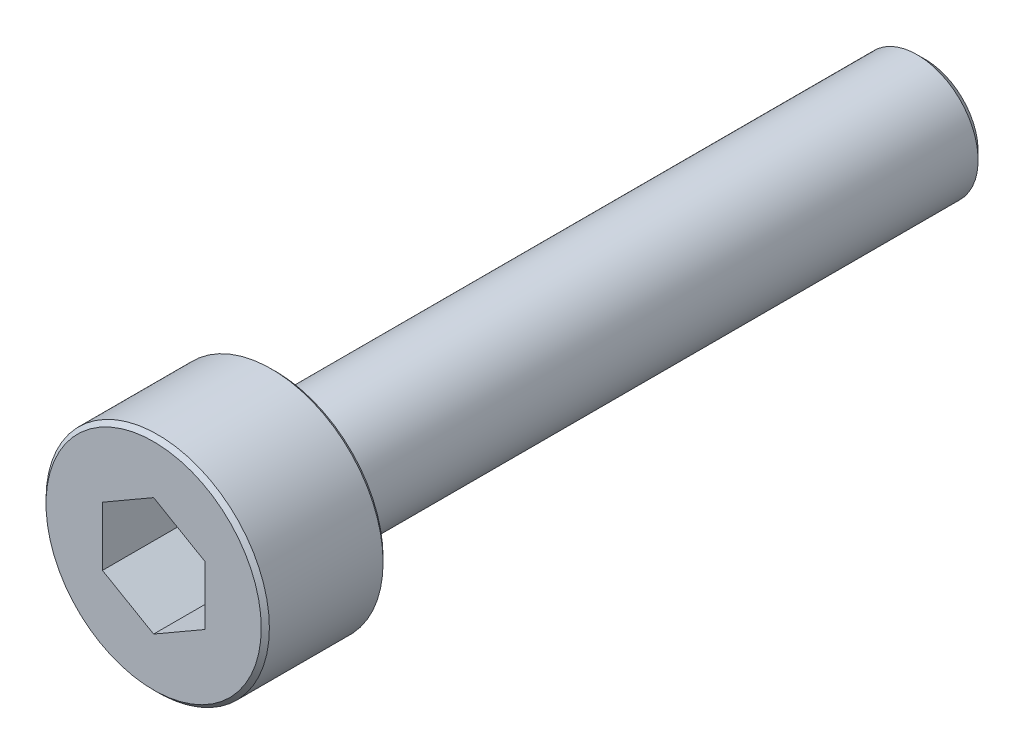
ISO-10303-21;
HEADER;
FILE_DESCRIPTION(('STEP AP214'),'2;1');
FILE_NAME('part.step','',(''),(''),'','','');
FILE_SCHEMA(('AUTOMOTIVE_DESIGN { 1 0 10303 214 1 1 1 1 }'));
ENDSEC;
DATA;
#1=APPLICATION_CONTEXT('core data for automotive mechanical design processes');
#2=APPLICATION_PROTOCOL_DEFINITION('international standard','automotive_design',2000,#1);
#3=PRODUCT_CONTEXT('',#1,'mechanical');
#4=PRODUCT('Part','Part','',(#3));
#5=PRODUCT_RELATED_PRODUCT_CATEGORY('part','',(#4));
#6=PRODUCT_DEFINITION_FORMATION('','',#4);
#7=PRODUCT_DEFINITION_CONTEXT('part definition',#1,'design');
#8=PRODUCT_DEFINITION('design','',#6,#7);
#9=PRODUCT_DEFINITION_SHAPE('','',#8);
#10=(LENGTH_UNIT() NAMED_UNIT(*) SI_UNIT(.MILLI.,.METRE.));
#11=(NAMED_UNIT(*) PLANE_ANGLE_UNIT() SI_UNIT($,.RADIAN.));
#12=(NAMED_UNIT(*) SI_UNIT($,.STERADIAN.) SOLID_ANGLE_UNIT());
#13=UNCERTAINTY_MEASURE_WITH_UNIT(LENGTH_MEASURE(1.E-05),#10,'distance_accuracy_value','');
#14=(GEOMETRIC_REPRESENTATION_CONTEXT(3) GLOBAL_UNCERTAINTY_ASSIGNED_CONTEXT((#13)) GLOBAL_UNIT_ASSIGNED_CONTEXT((#10,
#11,#12)) REPRESENTATION_CONTEXT('',''));
#15=CARTESIAN_POINT('',(0.,0.,0.));
#16=DIRECTION('',(0.,0.,1.));
#17=DIRECTION('',(1.,0.,0.));
#18=AXIS2_PLACEMENT_3D('',#15,#16,#17);
#19=CARTESIAN_POINT('',(0.,0.,16.));
#20=DIRECTION('',(0.,0.,1.));
#21=DIRECTION('',(1.,0.,0.));
#22=AXIS2_PLACEMENT_3D('',#19,#20,#21);
#23=CYLINDRICAL_SURFACE('',#22,2.75);
#24=CARTESIAN_POINT('',(0.,0.,16.1000012636342));
#25=DIRECTION('',(0.,0.,-1.));
#26=DIRECTION('',(-1.,0.,0.));
#27=AXIS2_PLACEMENT_3D('',#24,#25,#26);
#28=CIRCLE('',#27,2.75);
#29=CARTESIAN_POINT('',(2.75,0.,16.1000012636342));
#30=VERTEX_POINT('',#29);
#31=EDGE_CURVE('E155',#30,#30,#28,.F.);
#32=ORIENTED_EDGE('',*,*,#31,.T.);
#33=EDGE_LOOP('',(#32));
#34=FACE_BOUND('',#33,.T.);
#35=CARTESIAN_POINT('',(0.,0.,18.8999986849225));
#36=DIRECTION('',(0.,0.,1.));
#37=DIRECTION('',(1.,0.,0.));
#38=AXIS2_PLACEMENT_3D('',#35,#36,#37);
#39=CIRCLE('',#38,2.75);
#40=CARTESIAN_POINT('',(2.75,0.,18.8999986849225));
#41=VERTEX_POINT('',#40);
#42=EDGE_CURVE('E152',#41,#41,#39,.F.);
#43=ORIENTED_EDGE('',*,*,#42,.T.);
#44=EDGE_LOOP('',(#43));
#45=FACE_BOUND('',#44,.T.);
#46=ADVANCED_FACE('F41',(#34,#45),#23,.T.);
#47=CARTESIAN_POINT('',(2.75,0.,16.));
#48=DIRECTION('',(0.,0.,-1.));
#49=DIRECTION('',(-1.,0.,0.));
#50=AXIS2_PLACEMENT_3D('',#47,#48,#49);
#51=PLANE('',#50);
#52=CARTESIAN_POINT('',(0.,0.,16.));
#53=DIRECTION('',(0.,0.,-1.));
#54=DIRECTION('',(-1.,0.,0.));
#55=AXIS2_PLACEMENT_3D('',#52,#53,#54);
#56=CIRCLE('',#55,2.64999868492255);
#57=CARTESIAN_POINT('',(2.64999868492255,0.,16.));
#58=VERTEX_POINT('',#57);
#59=EDGE_CURVE('E158',#58,#58,#56,.T.);
#60=ORIENTED_EDGE('',*,*,#59,.T.);
#61=EDGE_LOOP('',(#60));
#62=FACE_BOUND('',#61,.T.);
#63=CARTESIAN_POINT('',(0.,0.,16.));
#64=DIRECTION('',(0.,0.,-1.));
#65=DIRECTION('',(-1.,0.,0.));
#66=AXIS2_PLACEMENT_3D('',#63,#64,#65);
#67=CIRCLE('',#66,1.5);
#68=CARTESIAN_POINT('',(-1.5,0.,16.));
#69=VERTEX_POINT('',#68);
#70=EDGE_CURVE('E144',#69,#69,#67,.T.);
#71=ORIENTED_EDGE('',*,*,#70,.F.);
#72=EDGE_LOOP('',(#71));
#73=FACE_BOUND('',#72,.T.);
#74=ADVANCED_FACE('F178',(#62,#73),#51,.T.);
#75=CARTESIAN_POINT('',(0.,0.,19.));
#76=DIRECTION('',(0.,0.,1.));
#77=DIRECTION('',(1.,0.,0.));
#78=AXIS2_PLACEMENT_3D('',#75,#76,#77);
#79=PLANE('',#78);
#80=CARTESIAN_POINT('',(0.,0.,19.));
#81=DIRECTION('',(0.,0.,1.));
#82=DIRECTION('',(1.,0.,0.));
#83=AXIS2_PLACEMENT_3D('',#80,#81,#82);
#84=CIRCLE('',#83,2.64999873636584);
#85=CARTESIAN_POINT('',(2.64999873636584,0.,19.));
#86=VERTEX_POINT('',#85);
#87=EDGE_CURVE('E161',#86,#86,#84,.T.);
#88=ORIENTED_EDGE('',*,*,#87,.T.);
#89=EDGE_LOOP('',(#88));
#90=FACE_BOUND('',#89,.T.);
#91=DIRECTION('',(0.,-1.,0.));
#92=VECTOR('',#91,1.);
#93=CARTESIAN_POINT('',(-1.26000000000002,0.727461339178926,19.));
#94=LINE('',#93,#92);
#95=CARTESIAN_POINT('',(-1.26000000000002,0.727461339178926,19.));
#96=VERTEX_POINT('',#95);
#97=CARTESIAN_POINT('',(-1.26,-0.7274613391789,19.));
#98=VERTEX_POINT('',#97);
#99=EDGE_CURVE('E57',#96,#98,#94,.T.);
#100=ORIENTED_EDGE('',*,*,#99,.F.);
#101=DIRECTION('',(-0.866025403784441,-0.499999999999996,0.));
#102=VECTOR('',#101,1.);
#103=CARTESIAN_POINT('',(0.,1.45492267835786,19.));
#104=LINE('',#103,#102);
#105=CARTESIAN_POINT('',(0.,1.45492267835786,19.));
#106=VERTEX_POINT('',#105);
#107=EDGE_CURVE('E140',#106,#96,#104,.T.);
#108=ORIENTED_EDGE('',*,*,#107,.F.);
#109=DIRECTION('',(-0.86602540378445,0.49999999999998,0.));
#110=VECTOR('',#109,1.);
#111=CARTESIAN_POINT('',(1.26000000000013,0.727461339178913,19.));
#112=LINE('',#111,#110);
#113=CARTESIAN_POINT('',(1.26000000000013,0.727461339178913,19.));
#114=VERTEX_POINT('',#113);
#115=EDGE_CURVE('E138',#114,#106,#112,.T.);
#116=ORIENTED_EDGE('',*,*,#115,.F.);
#117=DIRECTION('',(0.,1.,0.));
#118=VECTOR('',#117,1.);
#119=CARTESIAN_POINT('',(1.26000000000013,-0.727461339178913,19.));
#120=LINE('',#119,#118);
#121=CARTESIAN_POINT('',(1.26000000000013,-0.727461339178913,19.));
#122=VERTEX_POINT('',#121);
#123=EDGE_CURVE('E105',#122,#114,#120,.T.);
#124=ORIENTED_EDGE('',*,*,#123,.F.);
#125=DIRECTION('',(0.866025403784438,0.5,0.));
#126=VECTOR('',#125,1.);
#127=CARTESIAN_POINT('',(0.,-1.45492267835787,19.));
#128=LINE('',#127,#126);
#129=CARTESIAN_POINT('',(0.,-1.45492267835787,19.));
#130=VERTEX_POINT('',#129);
#131=EDGE_CURVE('E134',#130,#122,#128,.T.);
#132=ORIENTED_EDGE('',*,*,#131,.F.);
#133=DIRECTION('',(0.866025403784439,-0.5,0.));
#134=VECTOR('',#133,1.);
#135=CARTESIAN_POINT('',(-1.26,-0.7274613391789,19.));
#136=LINE('',#135,#134);
#137=EDGE_CURVE('E131',#98,#130,#136,.T.);
#138=ORIENTED_EDGE('',*,*,#137,.F.);
#139=EDGE_LOOP('',(#100,#108,#116,#124,#132,#138));
#140=FACE_BOUND('',#139,.T.);
#141=ADVANCED_FACE('F184',(#90,#140),#79,.T.);
#142=CARTESIAN_POINT('',(0.,0.,0.));
#143=DIRECTION('',(0.,0.,1.));
#144=DIRECTION('',(1.,0.,0.));
#145=AXIS2_PLACEMENT_3D('',#142,#143,#144);
#146=CYLINDRICAL_SURFACE('',#145,1.5);
#147=CARTESIAN_POINT('',(0.,0.,0.200019076914907));
#148=DIRECTION('',(0.,0.,-1.));
#149=DIRECTION('',(-1.,0.,0.));
#150=AXIS2_PLACEMENT_3D('',#147,#148,#149);
#151=CIRCLE('',#150,1.5);
#152=CARTESIAN_POINT('',(-1.5,0.,0.200019076914907));
#153=VERTEX_POINT('',#152);
#154=EDGE_CURVE('E11',#153,#153,#151,.F.);
#155=ORIENTED_EDGE('',*,*,#154,.T.);
#156=EDGE_LOOP('',(#155));
#157=FACE_BOUND('',#156,.T.);
#158=ORIENTED_EDGE('',*,*,#70,.T.);
#159=EDGE_LOOP('',(#158));
#160=FACE_BOUND('',#159,.T.);
#161=ADVANCED_FACE('F211',(#157,#160),#146,.T.);
#162=CARTESIAN_POINT('',(0.,0.,0.));
#163=DIRECTION('',(0.,0.,-1.));
#164=DIRECTION('',(-1.,0.,0.));
#165=AXIS2_PLACEMENT_3D('',#162,#163,#164);
#166=PLANE('',#165);
#167=CARTESIAN_POINT('',(0.,0.,0.));
#168=DIRECTION('',(0.,0.,-1.));
#169=DIRECTION('',(-1.,0.,0.));
#170=AXIS2_PLACEMENT_3D('',#167,#168,#169);
#171=CIRCLE('',#170,1.29998346685885);
#172=CARTESIAN_POINT('',(-1.29998346685885,0.,0.));
#173=VERTEX_POINT('',#172);
#174=EDGE_CURVE('E50',#173,#173,#171,.T.);
#175=ORIENTED_EDGE('',*,*,#174,.T.);
#176=EDGE_LOOP('',(#175));
#177=FACE_BOUND('',#176,.T.);
#178=ADVANCED_FACE('F166',(#177),#166,.T.);
#179=CARTESIAN_POINT('',(-1.26000000000002,0.727461339178926,16.75));
#180=DIRECTION('',(-1.,0.,0.));
#181=DIRECTION('',(0.,-1.,0.));
#182=AXIS2_PLACEMENT_3D('',#179,#180,#181);
#183=PLANE('',#182);
#184=ORIENTED_EDGE('',*,*,#99,.T.);
#185=DIRECTION('',(0.,0.,1.));
#186=VECTOR('',#185,1.);
#187=CARTESIAN_POINT('',(-1.26,-0.7274613391789,16.75));
#188=LINE('',#187,#186);
#189=CARTESIAN_POINT('',(-1.26,-0.7274613391789,16.75));
#190=VERTEX_POINT('',#189);
#191=EDGE_CURVE('E87',#190,#98,#188,.T.);
#192=ORIENTED_EDGE('',*,*,#191,.F.);
#193=DIRECTION('',(0.,-1.,0.));
#194=VECTOR('',#193,1.);
#195=CARTESIAN_POINT('',(-1.26000000000002,0.727461339178926,16.75));
#196=LINE('',#195,#194);
#197=CARTESIAN_POINT('',(-1.26000000000002,0.727461339178926,16.75));
#198=VERTEX_POINT('',#197);
#199=EDGE_CURVE('E142',#198,#190,#196,.T.);
#200=ORIENTED_EDGE('',*,*,#199,.F.);
#201=DIRECTION('',(0.,0.,1.));
#202=VECTOR('',#201,1.);
#203=CARTESIAN_POINT('',(-1.26000000000002,0.727461339178926,16.75));
#204=LINE('',#203,#202);
#205=EDGE_CURVE('E65',#198,#96,#204,.T.);
#206=ORIENTED_EDGE('',*,*,#205,.T.);
#207=EDGE_LOOP('',(#184,#192,#200,#206));
#208=FACE_BOUND('',#207,.T.);
#209=ADVANCED_FACE('F219',(#208),#183,.F.);
#210=CARTESIAN_POINT('',(0.,1.45492267835786,16.75));
#211=DIRECTION('',(-0.499999999999996,0.866025403784441,0.));
#212=DIRECTION('',(-0.866025403784441,-0.499999999999996,0.));
#213=AXIS2_PLACEMENT_3D('',#210,#211,#212);
#214=PLANE('',#213);
#215=ORIENTED_EDGE('',*,*,#107,.T.);
#216=ORIENTED_EDGE('',*,*,#205,.F.);
#217=DIRECTION('',(-0.866025403784441,-0.499999999999996,0.));
#218=VECTOR('',#217,1.);
#219=CARTESIAN_POINT('',(0.,1.45492267835786,16.75));
#220=LINE('',#219,#218);
#221=CARTESIAN_POINT('',(0.,1.45492267835786,16.75));
#222=VERTEX_POINT('',#221);
#223=EDGE_CURVE('E117',#222,#198,#220,.T.);
#224=ORIENTED_EDGE('',*,*,#223,.F.);
#225=DIRECTION('',(0.,0.,1.));
#226=VECTOR('',#225,1.);
#227=CARTESIAN_POINT('',(0.,1.45492267835786,16.75));
#228=LINE('',#227,#226);
#229=EDGE_CURVE('E109',#222,#106,#228,.T.);
#230=ORIENTED_EDGE('',*,*,#229,.T.);
#231=EDGE_LOOP('',(#215,#216,#224,#230));
#232=FACE_BOUND('',#231,.T.);
#233=ADVANCED_FACE('F225',(#232),#214,.F.);
#234=CARTESIAN_POINT('',(1.26000000000013,0.727461339178913,16.75));
#235=DIRECTION('',(0.49999999999998,0.86602540378445,0.));
#236=DIRECTION('',(-0.86602540378445,0.49999999999998,0.));
#237=AXIS2_PLACEMENT_3D('',#234,#235,#236);
#238=PLANE('',#237);
#239=ORIENTED_EDGE('',*,*,#115,.T.);
#240=ORIENTED_EDGE('',*,*,#229,.F.);
#241=DIRECTION('',(-0.86602540378445,0.49999999999998,0.));
#242=VECTOR('',#241,1.);
#243=CARTESIAN_POINT('',(1.26000000000013,0.727461339178913,16.75));
#244=LINE('',#243,#242);
#245=CARTESIAN_POINT('',(1.26000000000013,0.727461339178913,16.75));
#246=VERTEX_POINT('',#245);
#247=EDGE_CURVE('E113',#246,#222,#244,.T.);
#248=ORIENTED_EDGE('',*,*,#247,.F.);
#249=DIRECTION('',(0.,0.,1.));
#250=VECTOR('',#249,1.);
#251=CARTESIAN_POINT('',(1.26000000000013,0.727461339178913,16.75));
#252=LINE('',#251,#250);
#253=EDGE_CURVE('E98',#246,#114,#252,.T.);
#254=ORIENTED_EDGE('',*,*,#253,.T.);
#255=EDGE_LOOP('',(#239,#240,#248,#254));
#256=FACE_BOUND('',#255,.T.);
#257=ADVANCED_FACE('F114',(#256),#238,.F.);
#258=CARTESIAN_POINT('',(1.26000000000013,-0.727461339178913,16.75));
#259=DIRECTION('',(1.,0.,0.));
#260=DIRECTION('',(0.,0.,-1.));
#261=AXIS2_PLACEMENT_3D('',#258,#259,#260);
#262=PLANE('',#261);
#263=ORIENTED_EDGE('',*,*,#123,.T.);
#264=ORIENTED_EDGE('',*,*,#253,.F.);
#265=DIRECTION('',(0.,1.,0.));
#266=VECTOR('',#265,1.);
#267=CARTESIAN_POINT('',(1.26000000000013,-0.727461339178913,16.75));
#268=LINE('',#267,#266);
#269=CARTESIAN_POINT('',(1.26000000000013,-0.727461339178913,16.75));
#270=VERTEX_POINT('',#269);
#271=EDGE_CURVE('E102',#270,#246,#268,.T.);
#272=ORIENTED_EDGE('',*,*,#271,.F.);
#273=DIRECTION('',(0.,0.,1.));
#274=VECTOR('',#273,1.);
#275=CARTESIAN_POINT('',(1.26000000000013,-0.727461339178913,16.75));
#276=LINE('',#275,#274);
#277=EDGE_CURVE('E110',#270,#122,#276,.T.);
#278=ORIENTED_EDGE('',*,*,#277,.T.);
#279=EDGE_LOOP('',(#263,#264,#272,#278));
#280=FACE_BOUND('',#279,.T.);
#281=ADVANCED_FACE('F100',(#280),#262,.F.);
#282=CARTESIAN_POINT('',(0.,-1.45492267835787,16.75));
#283=DIRECTION('',(0.5,-0.866025403784439,0.));
#284=DIRECTION('',(0.866025403784439,0.5,0.));
#285=AXIS2_PLACEMENT_3D('',#282,#283,#284);
#286=PLANE('',#285);
#287=ORIENTED_EDGE('',*,*,#131,.T.);
#288=ORIENTED_EDGE('',*,*,#277,.F.);
#289=DIRECTION('',(0.866025403784438,0.5,0.));
#290=VECTOR('',#289,1.);
#291=CARTESIAN_POINT('',(0.,-1.45492267835787,16.75));
#292=LINE('',#291,#290);
#293=CARTESIAN_POINT('',(0.,-1.45492267835787,16.75));
#294=VERTEX_POINT('',#293);
#295=EDGE_CURVE('E123',#294,#270,#292,.T.);
#296=ORIENTED_EDGE('',*,*,#295,.F.);
#297=DIRECTION('',(0.,0.,1.));
#298=VECTOR('',#297,1.);
#299=CARTESIAN_POINT('',(0.,-1.45492267835787,16.75));
#300=LINE('',#299,#298);
#301=EDGE_CURVE('E147',#294,#130,#300,.T.);
#302=ORIENTED_EDGE('',*,*,#301,.T.);
#303=EDGE_LOOP('',(#287,#288,#296,#302));
#304=FACE_BOUND('',#303,.T.);
#305=ADVANCED_FACE('F228',(#304),#286,.F.);
#306=CARTESIAN_POINT('',(-1.26,-0.7274613391789,16.75));
#307=DIRECTION('',(-0.5,-0.866025403784439,0.));
#308=DIRECTION('',(0.866025403784439,-0.5,0.));
#309=AXIS2_PLACEMENT_3D('',#306,#307,#308);
#310=PLANE('',#309);
#311=ORIENTED_EDGE('',*,*,#137,.T.);
#312=ORIENTED_EDGE('',*,*,#301,.F.);
#313=DIRECTION('',(0.866025403784439,-0.5,0.));
#314=VECTOR('',#313,1.);
#315=CARTESIAN_POINT('',(-1.26,-0.7274613391789,16.75));
#316=LINE('',#315,#314);
#317=EDGE_CURVE('E125',#190,#294,#316,.T.);
#318=ORIENTED_EDGE('',*,*,#317,.F.);
#319=ORIENTED_EDGE('',*,*,#191,.T.);
#320=EDGE_LOOP('',(#311,#312,#318,#319));
#321=FACE_BOUND('',#320,.T.);
#322=ADVANCED_FACE('F203',(#321),#310,.F.);
#323=CARTESIAN_POINT('',(0.,0.,16.75));
#324=DIRECTION('',(0.,0.,1.));
#325=DIRECTION('',(1.,0.,0.));
#326=AXIS2_PLACEMENT_3D('',#323,#324,#325);
#327=PLANE('',#326);
#328=ORIENTED_EDGE('',*,*,#199,.T.);
#329=ORIENTED_EDGE('',*,*,#317,.T.);
#330=ORIENTED_EDGE('',*,*,#295,.T.);
#331=ORIENTED_EDGE('',*,*,#271,.T.);
#332=ORIENTED_EDGE('',*,*,#247,.T.);
#333=ORIENTED_EDGE('',*,*,#223,.T.);
#334=EDGE_LOOP('',(#328,#329,#330,#331,#332,#333));
#335=FACE_BOUND('',#334,.T.);
#336=ADVANCED_FACE('F120',(#335),#327,.T.);
#337=CARTESIAN_POINT('',(0.,0.,16.1000012636342));
#338=DIRECTION('',(0.,0.,1.));
#339=DIRECTION('',(1.,0.,0.));
#340=AXIS2_PLACEMENT_3D('',#337,#338,#339);
#341=CONICAL_SURFACE('',#340,2.75,0.785398420610581);
#342=CARTESIAN_POINT('',(2.64999868492255,0.,16.));
#343=CARTESIAN_POINT('',(2.65104036528794,0.,16.0010416798295));
#344=CARTESIAN_POINT('',(2.65208204565333,0.,16.002083359659));
#345=CARTESIAN_POINT('',(2.65416540638411,0.,16.0041667193181));
#346=CARTESIAN_POINT('',(2.6552070867495,0.,16.0052083991476));
#347=CARTESIAN_POINT('',(2.65729044748028,0.,16.0072917588067));
#348=CARTESIAN_POINT('',(2.65833212784567,0.,16.0083334386362));
#349=CARTESIAN_POINT('',(2.66041548857645,0.,16.0104167982952));
#350=CARTESIAN_POINT('',(2.66145716894184,0.,16.0114584781248));
#351=CARTESIAN_POINT('',(2.66354052967262,0.,16.0135418377838));
#352=CARTESIAN_POINT('',(2.66458221003801,0.,16.0145835176133));
#353=CARTESIAN_POINT('',(2.66666557076879,0.,16.0166668772724));
#354=CARTESIAN_POINT('',(2.66770725113418,0.,16.0177085571019));
#355=CARTESIAN_POINT('',(2.66979061186496,0.,16.0197919167609));
#356=CARTESIAN_POINT('',(2.67083229223035,0.,16.0208335965905));
#357=CARTESIAN_POINT('',(2.67291565296114,0.,16.0229169562495));
#358=CARTESIAN_POINT('',(2.67395733332652,0.,16.023958636079));
#359=CARTESIAN_POINT('',(2.6760406940573,0.,16.0260419957381));
#360=CARTESIAN_POINT('',(2.6770823744227,0.,16.0270836755676));
#361=CARTESIAN_POINT('',(2.67916573515348,0.,16.0291670352266));
#362=CARTESIAN_POINT('',(2.68020741551887,0.,16.0302087150562));
#363=CARTESIAN_POINT('',(2.68229077624965,0.,16.0322920747152));
#364=CARTESIAN_POINT('',(2.68333245661504,0.,16.0333337545447));
#365=CARTESIAN_POINT('',(2.68541581734582,0.,16.0354171142038));
#366=CARTESIAN_POINT('',(2.68645749771121,0.,16.0364587940333));
#367=CARTESIAN_POINT('',(2.68854085844199,0.,16.0385421536923));
#368=CARTESIAN_POINT('',(2.68958253880738,0.,16.0395838335219));
#369=CARTESIAN_POINT('',(2.69166589953816,0.,16.0416671931809));
#370=CARTESIAN_POINT('',(2.69270757990355,0.,16.0427088730104));
#371=CARTESIAN_POINT('',(2.69479094063433,0.,16.0447922326695));
#372=CARTESIAN_POINT('',(2.69583262099972,0.,16.045833912499));
#373=CARTESIAN_POINT('',(2.6979159817305,0.,16.047917272158));
#374=CARTESIAN_POINT('',(2.69895766209589,0.,16.0489589519876));
#375=CARTESIAN_POINT('',(2.70104102282667,0.,16.0510423116466));
#376=CARTESIAN_POINT('',(2.70208270319206,0.,16.0520839914761));
#377=CARTESIAN_POINT('',(2.70416606392284,0.,16.0541673511352));
#378=CARTESIAN_POINT('',(2.70520774428823,0.,16.0552090309647));
#379=CARTESIAN_POINT('',(2.70729110501901,0.,16.0572923906237));
#380=CARTESIAN_POINT('',(2.7083327853844,0.,16.0583340704533));
#381=CARTESIAN_POINT('',(2.71041614611518,0.,16.0604174301123));
#382=CARTESIAN_POINT('',(2.71145782648057,0.,16.0614591099418));
#383=CARTESIAN_POINT('',(2.71354118721135,0.,16.0635424696009));
#384=CARTESIAN_POINT('',(2.71458286757674,0.,16.0645841494304));
#385=CARTESIAN_POINT('',(2.71666622830752,0.,16.0666675090894));
#386=CARTESIAN_POINT('',(2.71770790867291,0.,16.067709188919));
#387=CARTESIAN_POINT('',(2.71979126940369,0.,16.069792548578));
#388=CARTESIAN_POINT('',(2.72083294976908,0.,16.0708342284075));
#389=CARTESIAN_POINT('',(2.72291631049986,0.,16.0729175880666));
#390=CARTESIAN_POINT('',(2.72395799086525,0.,16.0739592678961));
#391=CARTESIAN_POINT('',(2.72604135159603,0.,16.0760426275551));
#392=CARTESIAN_POINT('',(2.72708303196142,0.,16.0770843073847));
#393=CARTESIAN_POINT('',(2.7291663926922,0.,16.0791676670437));
#394=CARTESIAN_POINT('',(2.73020807305759,0.,16.0802093468732));
#395=CARTESIAN_POINT('',(2.73229143378837,0.,16.0822927065323));
#396=CARTESIAN_POINT('',(2.73333311415376,0.,16.0833343863618));
#397=CARTESIAN_POINT('',(2.73541647488454,0.,16.0854177460208));
#398=CARTESIAN_POINT('',(2.73645815524993,0.,16.0864594258504));
#399=CARTESIAN_POINT('',(2.73854151598071,0.,16.0885427855094));
#400=CARTESIAN_POINT('',(2.7395831963461,0.,16.0895844653389));
#401=CARTESIAN_POINT('',(2.74166655707688,0.,16.091667824998));
#402=CARTESIAN_POINT('',(2.74270823744227,0.,16.0927095048275));
#403=CARTESIAN_POINT('',(2.74479159817305,0.,16.0947928644865));
#404=CARTESIAN_POINT('',(2.74583327853844,0.,16.0958345443161));
#405=CARTESIAN_POINT('',(2.74791663926922,0.,16.0979179039751));
#406=CARTESIAN_POINT('',(2.74895831963461,0.,16.0989595838046));
#407=CARTESIAN_POINT('',(2.75,0.,16.1000012636342));
#408=B_SPLINE_CURVE_WITH_KNOTS('',3,(#342,#343,#344,#345,#346,#347,#348,#349,#350,#351,#352,
#353,#354,#355,#356,#357,#358,#359,#360,#361,#362,#363,#364,#365,#366,#367,#368,#369,#370,#371,
#372,#373,#374,#375,#376,#377,#378,#379,#380,#381,#382,#383,#384,#385,#386,#387,#388,#389,#390,
#391,#392,#393,#394,#395,#396,#397,#398,#399,#400,#401,#402,#403,#404,#405,#406,#407),
.UNSPECIFIED.,.F.,.F.,(4,2,2,2,2,2,2,2,2,2,2,2,2,2,2,2,2,2,2,2,2,2,2,2,2,2,2,2,2,2,2,2,4),(0.,
0.00441947436442882,0.00883894872885978,0.0132584230932911,0.0176778974577223,
0.0220973718221508,0.0265168461865821,0.0309363205510134,0.0353557949154444,0.0397752692798732,
0.0441947436443045,0.0486142180087357,0.0530336923731667,0.0574531667375955,0.0618726411020268,
0.0662921154664577,0.070711589830889,0.0751310641953178,0.0795505385597488,0.0839700129241801,
0.0883894872886113,0.0928089616530399,0.0972284360174711,0.101647910381902,0.106067384746333,
0.110486859110762,0.114906333475193,0.119325807839625,0.123745282204056,0.128164756568485,
0.132584230932916,0.137003705297347,0.141423179661776),.UNSPECIFIED.);
#409=EDGE_CURVE('BSEAM174',#58,#30,#408,.T.);
#410=ORIENTED_EDGE('',*,*,#59,.F.);
#411=ORIENTED_EDGE('',*,*,#31,.F.);
#412=ORIENTED_EDGE('',*,*,#409,.T.);
#413=ORIENTED_EDGE('',*,*,#409,.F.);
#414=EDGE_LOOP('',(#410,#412,#411,#413));
#415=FACE_BOUND('',#414,.T.);
#416=ADVANCED_FACE('F174',(#415),#341,.T.);
#417=CARTESIAN_POINT('',(0.,0.,19.));
#418=DIRECTION('',(0.,0.,-1.));
#419=DIRECTION('',(-1.,0.,0.));
#420=AXIS2_PLACEMENT_3D('',#417,#418,#419);
#421=CONICAL_SURFACE('',#420,2.64999873636584,0.785397906184299);
#422=ORIENTED_EDGE('',*,*,#42,.F.);
#423=EDGE_LOOP('',(#422));
#424=FACE_BOUND('',#423,.T.);
#425=ORIENTED_EDGE('',*,*,#87,.F.);
#426=EDGE_LOOP('',(#425));
#427=FACE_BOUND('',#426,.T.);
#428=ADVANCED_FACE('F169',(#424,#427),#421,.T.);
#429=CARTESIAN_POINT('',(0.,0.,0.));
#430=DIRECTION('',(0.,0.,1.));
#431=DIRECTION('',(1.,0.,0.));
#432=AXIS2_PLACEMENT_3D('',#429,#430,#431);
#433=CONICAL_SURFACE('',#432,1.29998346685885,0.785391804529148);
#434=ORIENTED_EDGE('',*,*,#154,.F.);
#435=EDGE_LOOP('',(#434));
#436=FACE_BOUND('',#435,.T.);
#437=ORIENTED_EDGE('',*,*,#174,.F.);
#438=EDGE_LOOP('',(#437));
#439=FACE_BOUND('',#438,.T.);
#440=ADVANCED_FACE('F44',(#436,#439),#433,.T.);
#441=CLOSED_SHELL('',(#46,#74,#141,#161,#178,#209,#233,#257,#281,#305,#322,#336,#416,#428,#440));
#442=MANIFOLD_SOLID_BREP('B2',#441);
#443=ADVANCED_BREP_SHAPE_REPRESENTATION('',(#18,#442),#14);
#444=SHAPE_DEFINITION_REPRESENTATION(#9,#443);
ENDSEC;
END-ISO-10303-21;
